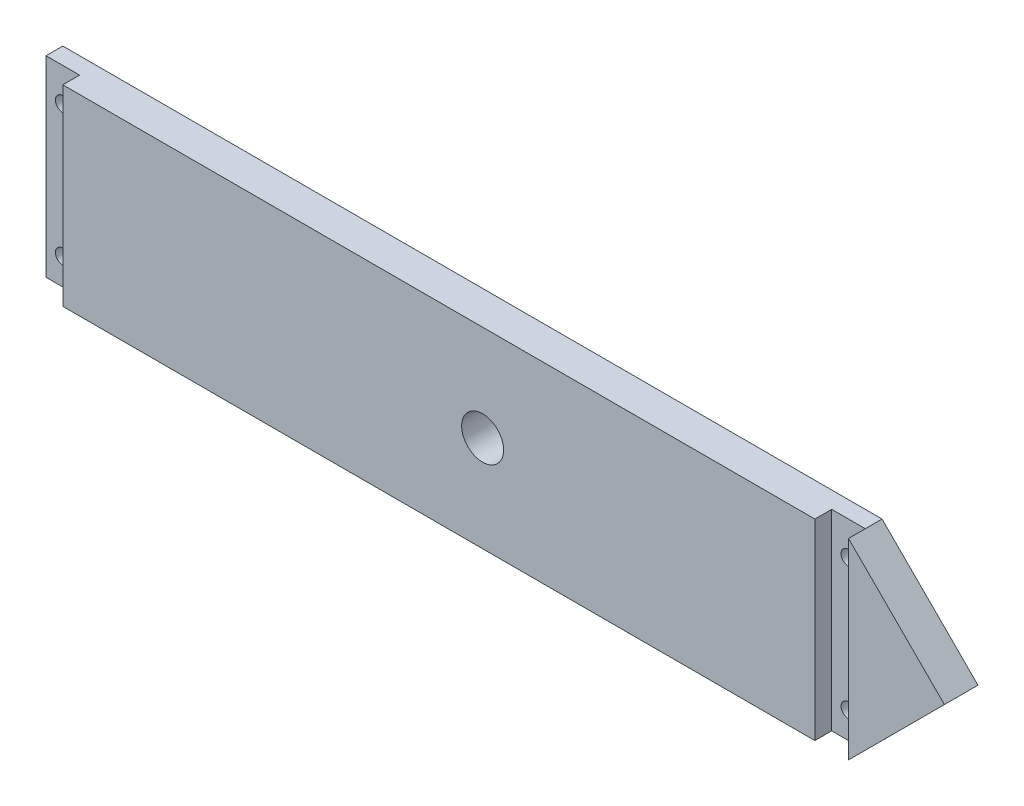
ISO-10303-21;
HEADER;
FILE_DESCRIPTION(('STEP AP214'),'2;1');
FILE_NAME('part.step','',(''),(''),'','','');
FILE_SCHEMA(('AUTOMOTIVE_DESIGN { 1 0 10303 214 1 1 1 1 }'));
ENDSEC;
DATA;
#1=APPLICATION_CONTEXT('core data for automotive mechanical design processes');
#2=APPLICATION_PROTOCOL_DEFINITION('international standard','automotive_design',2000,#1);
#3=PRODUCT_CONTEXT('',#1,'mechanical');
#4=PRODUCT('Part','Part','',(#3));
#5=PRODUCT_RELATED_PRODUCT_CATEGORY('part','',(#4));
#6=PRODUCT_DEFINITION_FORMATION('','',#4);
#7=PRODUCT_DEFINITION_CONTEXT('part definition',#1,'design');
#8=PRODUCT_DEFINITION('design','',#6,#7);
#9=PRODUCT_DEFINITION_SHAPE('','',#8);
#10=(LENGTH_UNIT() NAMED_UNIT(*) SI_UNIT(.MILLI.,.METRE.));
#11=(NAMED_UNIT(*) PLANE_ANGLE_UNIT() SI_UNIT($,.RADIAN.));
#12=(NAMED_UNIT(*) SI_UNIT($,.STERADIAN.) SOLID_ANGLE_UNIT());
#13=UNCERTAINTY_MEASURE_WITH_UNIT(LENGTH_MEASURE(1.E-05),#10,'distance_accuracy_value','');
#14=(GEOMETRIC_REPRESENTATION_CONTEXT(3) GLOBAL_UNCERTAINTY_ASSIGNED_CONTEXT((#13)) GLOBAL_UNIT_ASSIGNED_CONTEXT((#10,
#11,#12)) REPRESENTATION_CONTEXT('',''));
#15=CARTESIAN_POINT('',(0.,0.,0.));
#16=DIRECTION('',(0.,0.,1.));
#17=DIRECTION('',(1.,0.,0.));
#18=AXIS2_PLACEMENT_3D('',#15,#16,#17);
#19=CARTESIAN_POINT('',(86.51875,-18.13941,6.35));
#20=DIRECTION('',(0.,0.,-1.));
#21=DIRECTION('',(-1.,0.,0.));
#22=AXIS2_PLACEMENT_3D('',#19,#20,#21);
#23=PLANE('',#22);
#24=CARTESIAN_POINT('',(-0.793749999999996,0.,6.35));
#25=DIRECTION('',(0.,0.,1.));
#26=DIRECTION('',(1.,0.,0.));
#27=AXIS2_PLACEMENT_3D('',#24,#25,#26);
#28=CIRCLE('',#27,3.96875);
#29=CARTESIAN_POINT('',(3.175,0.,6.35));
#30=VERTEX_POINT('',#29);
#31=EDGE_CURVE('E148',#30,#30,#28,.T.);
#32=ORIENTED_EDGE('',*,*,#31,.F.);
#33=EDGE_LOOP('',(#32));
#34=FACE_BOUND('',#33,.T.);
#35=DIRECTION('',(1.,0.,0.));
#36=VECTOR('',#35,1.);
#37=CARTESIAN_POINT('',(86.51875,-18.13941,6.35));
#38=LINE('',#37,#36);
#39=CARTESIAN_POINT('',(-80.1687499999997,-18.13941,6.35));
#40=VERTEX_POINT('',#39);
#41=CARTESIAN_POINT('',(62.0306100000001,-18.13941,6.35));
#42=VERTEX_POINT('',#41);
#43=EDGE_CURVE('E138',#40,#42,#38,.T.);
#44=ORIENTED_EDGE('',*,*,#43,.T.);
#45=DIRECTION('',(0.,-1.,0.));
#46=VECTOR('',#45,1.);
#47=CARTESIAN_POINT('',(62.0306100000001,-18.13941,6.35));
#48=LINE('',#47,#46);
#49=CARTESIAN_POINT('',(62.0306100000001,18.13941,6.35));
#50=VERTEX_POINT('',#49);
#51=EDGE_CURVE('E188',#50,#42,#48,.T.);
#52=ORIENTED_EDGE('',*,*,#51,.F.);
#53=DIRECTION('',(-1.,0.,0.));
#54=VECTOR('',#53,1.);
#55=CARTESIAN_POINT('',(86.51875,18.13941,6.35));
#56=LINE('',#55,#54);
#57=CARTESIAN_POINT('',(-80.1687499999999,18.13941,6.35));
#58=VERTEX_POINT('',#57);
#59=EDGE_CURVE('E135',#50,#58,#56,.T.);
#60=ORIENTED_EDGE('',*,*,#59,.T.);
#61=DIRECTION('',(0.,1.,0.));
#62=VECTOR('',#61,1.);
#63=CARTESIAN_POINT('',(-80.1687499999999,18.13941,6.35));
#64=LINE('',#63,#62);
#65=EDGE_CURVE('E209',#40,#58,#64,.T.);
#66=ORIENTED_EDGE('',*,*,#65,.F.);
#67=EDGE_LOOP('',(#44,#52,#60,#66));
#68=FACE_BOUND('',#67,.T.);
#69=ADVANCED_FACE('F31',(#34,#68),#23,.F.);
#70=CARTESIAN_POINT('',(86.51875,18.13941,6.35));
#71=DIRECTION('',(0.,-1.,0.));
#72=DIRECTION('',(1.,0.,0.));
#73=AXIS2_PLACEMENT_3D('',#70,#71,#72);
#74=PLANE('',#73);
#75=DIRECTION('',(-1.,0.,0.));
#76=VECTOR('',#75,1.);
#77=CARTESIAN_POINT('',(62.0306100000001,18.13941,3.175));
#78=LINE('',#77,#76);
#79=CARTESIAN_POINT('',(68.3806100000099,18.1394100000318,3.175));
#80=VERTEX_POINT('',#79);
#81=CARTESIAN_POINT('',(62.0306100000001,18.13941,3.175));
#82=VERTEX_POINT('',#81);
#83=EDGE_CURVE('E200',#80,#82,#78,.T.);
#84=ORIENTED_EDGE('',*,*,#83,.F.);
#85=DIRECTION('',(0.,0.,1.));
#86=VECTOR('',#85,1.);
#87=CARTESIAN_POINT('',(68.3806100000099,18.1394100000318,0.));
#88=LINE('',#87,#86);
#89=CARTESIAN_POINT('',(68.3806100000099,18.1394100000318,0.));
#90=VERTEX_POINT('',#89);
#91=EDGE_CURVE('E120',#90,#80,#88,.T.);
#92=ORIENTED_EDGE('',*,*,#91,.F.);
#93=DIRECTION('',(-1.,0.,0.));
#94=VECTOR('',#93,1.);
#95=CARTESIAN_POINT('',(86.51875,18.13941,0.));
#96=LINE('',#95,#94);
#97=CARTESIAN_POINT('',(-86.51875,18.13941,0.));
#98=VERTEX_POINT('',#97);
#99=EDGE_CURVE('E140',#90,#98,#96,.T.);
#100=ORIENTED_EDGE('',*,*,#99,.T.);
#101=DIRECTION('',(0.,0.,-1.));
#102=VECTOR('',#101,1.);
#103=CARTESIAN_POINT('',(-86.51875,18.13941,6.35));
#104=LINE('',#103,#102);
#105=CARTESIAN_POINT('',(-86.51875,18.13941,3.175));
#106=VERTEX_POINT('',#105);
#107=EDGE_CURVE('E11',#106,#98,#104,.T.);
#108=ORIENTED_EDGE('',*,*,#107,.F.);
#109=DIRECTION('',(-1.,0.,0.));
#110=VECTOR('',#109,1.);
#111=CARTESIAN_POINT('',(-86.51875,18.13941,3.175));
#112=LINE('',#111,#110);
#113=CARTESIAN_POINT('',(-80.1687499999999,18.13941,3.175));
#114=VERTEX_POINT('',#113);
#115=EDGE_CURVE('E223',#114,#106,#112,.T.);
#116=ORIENTED_EDGE('',*,*,#115,.F.);
#117=DIRECTION('',(0.,0.,1.));
#118=VECTOR('',#117,1.);
#119=CARTESIAN_POINT('',(-80.1687499999999,18.13941,3.175));
#120=LINE('',#119,#118);
#121=EDGE_CURVE('E226',#114,#58,#120,.T.);
#122=ORIENTED_EDGE('',*,*,#121,.T.);
#123=ORIENTED_EDGE('',*,*,#59,.F.);
#124=DIRECTION('',(0.,0.,1.));
#125=VECTOR('',#124,1.);
#126=CARTESIAN_POINT('',(62.0306100000001,18.13941,3.175));
#127=LINE('',#126,#125);
#128=EDGE_CURVE('E207',#82,#50,#127,.T.);
#129=ORIENTED_EDGE('',*,*,#128,.F.);
#130=EDGE_LOOP('',(#84,#92,#100,#108,#116,#122,#123,#129));
#131=FACE_BOUND('',#130,.T.);
#132=ADVANCED_FACE('F33',(#131),#74,.F.);
#133=CARTESIAN_POINT('',(-86.51875,18.13941,6.35));
#134=DIRECTION('',(1.,0.,0.));
#135=DIRECTION('',(0.,0.,-1.));
#136=AXIS2_PLACEMENT_3D('',#133,#134,#135);
#137=PLANE('',#136);
#138=DIRECTION('',(0.,0.,-1.));
#139=VECTOR('',#138,1.);
#140=CARTESIAN_POINT('',(-86.51875,-18.13941,6.35));
#141=LINE('',#140,#139);
#142=CARTESIAN_POINT('',(-86.51875,-18.13941,3.175));
#143=VERTEX_POINT('',#142);
#144=CARTESIAN_POINT('',(-86.51875,-18.13941,0.));
#145=VERTEX_POINT('',#144);
#146=EDGE_CURVE('E40',#143,#145,#141,.T.);
#147=ORIENTED_EDGE('',*,*,#146,.F.);
#148=DIRECTION('',(0.,-1.,0.));
#149=VECTOR('',#148,1.);
#150=CARTESIAN_POINT('',(-86.51875,-18.13941,3.175));
#151=LINE('',#150,#149);
#152=EDGE_CURVE('E215',#106,#143,#151,.T.);
#153=ORIENTED_EDGE('',*,*,#152,.F.);
#154=ORIENTED_EDGE('',*,*,#107,.T.);
#155=DIRECTION('',(0.,-1.,0.));
#156=VECTOR('',#155,1.);
#157=CARTESIAN_POINT('',(-86.51875,18.13941,0.));
#158=LINE('',#157,#156);
#159=EDGE_CURVE('E136',#98,#145,#158,.T.);
#160=ORIENTED_EDGE('',*,*,#159,.T.);
#161=EDGE_LOOP('',(#147,#153,#154,#160));
#162=FACE_BOUND('',#161,.T.);
#163=ADVANCED_FACE('F238',(#162),#137,.F.);
#164=CARTESIAN_POINT('',(86.51875,-18.13941,6.35));
#165=DIRECTION('',(0.,1.,0.));
#166=DIRECTION('',(-1.,0.,0.));
#167=AXIS2_PLACEMENT_3D('',#164,#165,#166);
#168=PLANE('',#167);
#169=DIRECTION('',(1.,0.,0.));
#170=VECTOR('',#169,1.);
#171=CARTESIAN_POINT('',(86.51875,-18.13941,0.));
#172=LINE('',#171,#170);
#173=CARTESIAN_POINT('',(68.38061,-18.13941,0.));
#174=VERTEX_POINT('',#173);
#175=EDGE_CURVE('E127',#145,#174,#172,.T.);
#176=ORIENTED_EDGE('',*,*,#175,.T.);
#177=DIRECTION('',(0.,0.,1.));
#178=VECTOR('',#177,1.);
#179=CARTESIAN_POINT('',(68.38061,-18.13941,0.));
#180=LINE('',#179,#178);
#181=CARTESIAN_POINT('',(68.38061,-18.13941,3.175));
#182=VERTEX_POINT('',#181);
#183=EDGE_CURVE('E110',#174,#182,#180,.T.);
#184=ORIENTED_EDGE('',*,*,#183,.T.);
#185=DIRECTION('',(1.,0.,0.));
#186=VECTOR('',#185,1.);
#187=CARTESIAN_POINT('',(68.38061,-18.13941,3.175));
#188=LINE('',#187,#186);
#189=CARTESIAN_POINT('',(62.0306100000001,-18.13941,3.175));
#190=VERTEX_POINT('',#189);
#191=EDGE_CURVE('E193',#190,#182,#188,.T.);
#192=ORIENTED_EDGE('',*,*,#191,.F.);
#193=DIRECTION('',(0.,0.,1.));
#194=VECTOR('',#193,1.);
#195=CARTESIAN_POINT('',(62.0306100000001,-18.13941,3.175));
#196=LINE('',#195,#194);
#197=EDGE_CURVE('E203',#190,#42,#196,.T.);
#198=ORIENTED_EDGE('',*,*,#197,.T.);
#199=ORIENTED_EDGE('',*,*,#43,.F.);
#200=DIRECTION('',(0.,0.,1.));
#201=VECTOR('',#200,1.);
#202=CARTESIAN_POINT('',(-80.1687499999997,-18.13941,3.175));
#203=LINE('',#202,#201);
#204=CARTESIAN_POINT('',(-80.1687499999997,-18.13941,3.175));
#205=VERTEX_POINT('',#204);
#206=EDGE_CURVE('E56',#205,#40,#203,.T.);
#207=ORIENTED_EDGE('',*,*,#206,.F.);
#208=DIRECTION('',(1.,0.,0.));
#209=VECTOR('',#208,1.);
#210=CARTESIAN_POINT('',(-80.1687499999997,-18.13941,3.175));
#211=LINE('',#210,#209);
#212=EDGE_CURVE('E217',#143,#205,#211,.T.);
#213=ORIENTED_EDGE('',*,*,#212,.F.);
#214=ORIENTED_EDGE('',*,*,#146,.T.);
#215=EDGE_LOOP('',(#176,#184,#192,#198,#199,#207,#213,#214));
#216=FACE_BOUND('',#215,.T.);
#217=ADVANCED_FACE('F131',(#216),#168,.F.);
#218=DIRECTION('',(0.,1.,0.));
#219=VECTOR('',#218,1.);
#220=CARTESIAN_POINT('',(68.3806100000001,18.13941,6.35));
#221=LINE('',#220,#219);
#222=CARTESIAN_POINT('',(68.38061,-18.13941,6.35));
#223=VERTEX_POINT('',#222);
#224=CARTESIAN_POINT('',(68.3806100000099,18.1394100000318,6.35));
#225=VERTEX_POINT('',#224);
#226=EDGE_CURVE('E194',#223,#225,#221,.T.);
#227=ORIENTED_EDGE('',*,*,#226,.F.);
#228=DIRECTION('',(-0.707082026446583,-0.707131535059916,0.));
#229=VECTOR('',#228,1.);
#230=CARTESIAN_POINT('',(86.5187500000194,0.,6.35));
#231=LINE('',#230,#229);
#232=CARTESIAN_POINT('',(86.5187500000194,0.,6.35));
#233=VERTEX_POINT('',#232);
#234=EDGE_CURVE('E48',#233,#223,#231,.T.);
#235=ORIENTED_EDGE('',*,*,#234,.F.);
#236=DIRECTION('',(0.70708202644577,-0.707131535060729,0.));
#237=VECTOR('',#236,1.);
#238=CARTESIAN_POINT('',(86.5187500000194,0.,6.35));
#239=LINE('',#238,#237);
#240=EDGE_CURVE('E129',#225,#233,#239,.T.);
#241=ORIENTED_EDGE('',*,*,#240,.F.);
#242=EDGE_LOOP('',(#227,#235,#241));
#243=FACE_BOUND('',#242,.T.);
#244=ADVANCED_FACE('F259',(#243),#23,.F.);
#245=CARTESIAN_POINT('',(86.51875,-18.13941,0.));
#246=DIRECTION('',(0.,0.,-1.));
#247=DIRECTION('',(-1.,0.,0.));
#248=AXIS2_PLACEMENT_3D('',#245,#246,#247);
#249=PLANE('',#248);
#250=CARTESIAN_POINT('',(-83.34375,11.7894100000325,0.));
#251=DIRECTION('',(0.,0.,-1.));
#252=DIRECTION('',(-1.,0.,0.));
#253=AXIS2_PLACEMENT_3D('',#250,#251,#252);
#254=CIRCLE('',#253,2.75844);
#255=CARTESIAN_POINT('',(-86.10219,11.7894100000325,0.));
#256=VERTEX_POINT('',#255);
#257=EDGE_CURVE('E427',#256,#256,#254,.T.);
#258=ORIENTED_EDGE('',*,*,#257,.F.);
#259=EDGE_LOOP('',(#258));
#260=FACE_BOUND('',#259,.T.);
#261=CARTESIAN_POINT('',(-83.34375,-13.1787899999682,0.));
#262=DIRECTION('',(0.,0.,-1.));
#263=DIRECTION('',(-1.,0.,0.));
#264=AXIS2_PLACEMENT_3D('',#261,#262,#263);
#265=CIRCLE('',#264,2.75844);
#266=CARTESIAN_POINT('',(-86.10219,-13.1787899999682,0.));
#267=VERTEX_POINT('',#266);
#268=EDGE_CURVE('E163',#267,#267,#265,.T.);
#269=ORIENTED_EDGE('',*,*,#268,.F.);
#270=EDGE_LOOP('',(#269));
#271=FACE_BOUND('',#270,.T.);
#272=CARTESIAN_POINT('',(65.20561,11.7894100000312,0.));
#273=DIRECTION('',(0.,0.,-1.));
#274=DIRECTION('',(-1.,0.,0.));
#275=AXIS2_PLACEMENT_3D('',#272,#273,#274);
#276=CIRCLE('',#275,2.75844);
#277=CARTESIAN_POINT('',(62.44717,11.7894100000312,0.));
#278=VERTEX_POINT('',#277);
#279=EDGE_CURVE('E156',#278,#278,#276,.T.);
#280=ORIENTED_EDGE('',*,*,#279,.F.);
#281=EDGE_LOOP('',(#280));
#282=FACE_BOUND('',#281,.T.);
#283=CARTESIAN_POINT('',(65.20561,-13.1787899999682,0.));
#284=DIRECTION('',(0.,0.,-1.));
#285=DIRECTION('',(-1.,0.,0.));
#286=AXIS2_PLACEMENT_3D('',#283,#284,#285);
#287=CIRCLE('',#286,2.75844);
#288=CARTESIAN_POINT('',(62.44717,-13.1787899999682,0.));
#289=VERTEX_POINT('',#288);
#290=EDGE_CURVE('E152',#289,#289,#287,.T.);
#291=ORIENTED_EDGE('',*,*,#290,.F.);
#292=EDGE_LOOP('',(#291));
#293=FACE_BOUND('',#292,.T.);
#294=CARTESIAN_POINT('',(-0.793749999999996,0.,0.));
#295=DIRECTION('',(0.,0.,1.));
#296=DIRECTION('',(1.,0.,0.));
#297=AXIS2_PLACEMENT_3D('',#294,#295,#296);
#298=CIRCLE('',#297,3.96875);
#299=CARTESIAN_POINT('',(3.175,0.,0.));
#300=VERTEX_POINT('',#299);
#301=EDGE_CURVE('E177',#300,#300,#298,.T.);
#302=ORIENTED_EDGE('',*,*,#301,.T.);
#303=EDGE_LOOP('',(#302));
#304=FACE_BOUND('',#303,.T.);
#305=DIRECTION('',(-0.707082026446583,-0.707131535059916,0.));
#306=VECTOR('',#305,1.);
#307=CARTESIAN_POINT('',(86.5187500000194,0.,0.));
#308=LINE('',#307,#306);
#309=CARTESIAN_POINT('',(86.5187500000194,0.,0.));
#310=VERTEX_POINT('',#309);
#311=EDGE_CURVE('E113',#310,#174,#308,.T.);
#312=ORIENTED_EDGE('',*,*,#311,.T.);
#313=ORIENTED_EDGE('',*,*,#175,.F.);
#314=ORIENTED_EDGE('',*,*,#159,.F.);
#315=ORIENTED_EDGE('',*,*,#99,.F.);
#316=DIRECTION('',(0.70708202644577,-0.707131535060729,0.));
#317=VECTOR('',#316,1.);
#318=CARTESIAN_POINT('',(86.5187500000194,0.,0.));
#319=LINE('',#318,#317);
#320=EDGE_CURVE('E121',#90,#310,#319,.T.);
#321=ORIENTED_EDGE('',*,*,#320,.T.);
#322=EDGE_LOOP('',(#312,#313,#314,#315,#321));
#323=FACE_BOUND('',#322,.T.);
#324=ADVANCED_FACE('F125',(#260,#271,#282,#293,#304,#323),#249,.T.);
#325=CARTESIAN_POINT('',(-80.1687499999999,18.13941,3.175));
#326=DIRECTION('',(1.,0.,0.));
#327=DIRECTION('',(0.,1.,0.));
#328=AXIS2_PLACEMENT_3D('',#325,#326,#327);
#329=PLANE('',#328);
#330=ORIENTED_EDGE('',*,*,#65,.T.);
#331=ORIENTED_EDGE('',*,*,#121,.F.);
#332=DIRECTION('',(0.,1.,0.));
#333=VECTOR('',#332,1.);
#334=CARTESIAN_POINT('',(-80.1687499999999,18.13941,3.175));
#335=LINE('',#334,#333);
#336=EDGE_CURVE('E220',#205,#114,#335,.T.);
#337=ORIENTED_EDGE('',*,*,#336,.F.);
#338=ORIENTED_EDGE('',*,*,#206,.T.);
#339=EDGE_LOOP('',(#330,#331,#337,#338));
#340=FACE_BOUND('',#339,.T.);
#341=ADVANCED_FACE('F245',(#340),#329,.F.);
#342=CARTESIAN_POINT('',(-86.51875,18.13941,3.175));
#343=DIRECTION('',(0.,0.,-1.));
#344=DIRECTION('',(-1.,0.,0.));
#345=AXIS2_PLACEMENT_3D('',#342,#343,#344);
#346=PLANE('',#345);
#347=CARTESIAN_POINT('',(-83.34375,11.7894100000325,3.175));
#348=DIRECTION('',(0.,0.,-1.));
#349=DIRECTION('',(-1.,0.,0.));
#350=AXIS2_PLACEMENT_3D('',#347,#348,#349);
#351=CIRCLE('',#350,1.39699999999998);
#352=CARTESIAN_POINT('',(-84.74075,11.7894100000325,3.175));
#353=VERTEX_POINT('',#352);
#354=EDGE_CURVE('E35',#353,#353,#351,.T.);
#355=ORIENTED_EDGE('',*,*,#354,.T.);
#356=EDGE_LOOP('',(#355));
#357=FACE_BOUND('',#356,.T.);
#358=CARTESIAN_POINT('',(-83.34375,-13.1787899999682,3.175));
#359=DIRECTION('',(0.,0.,-1.));
#360=DIRECTION('',(-1.,0.,0.));
#361=AXIS2_PLACEMENT_3D('',#358,#359,#360);
#362=CIRCLE('',#361,1.39699999999998);
#363=CARTESIAN_POINT('',(-84.74075,-13.1787899999682,3.175));
#364=VERTEX_POINT('',#363);
#365=EDGE_CURVE('E154',#364,#364,#362,.T.);
#366=ORIENTED_EDGE('',*,*,#365,.T.);
#367=EDGE_LOOP('',(#366));
#368=FACE_BOUND('',#367,.T.);
#369=ORIENTED_EDGE('',*,*,#152,.T.);
#370=ORIENTED_EDGE('',*,*,#212,.T.);
#371=ORIENTED_EDGE('',*,*,#336,.T.);
#372=ORIENTED_EDGE('',*,*,#115,.T.);
#373=EDGE_LOOP('',(#369,#370,#371,#372));
#374=FACE_BOUND('',#373,.T.);
#375=ADVANCED_FACE('F240',(#357,#368,#374),#346,.F.);
#376=CARTESIAN_POINT('',(62.0306100000001,-18.13941,3.175));
#377=DIRECTION('',(-1.,0.,0.));
#378=DIRECTION('',(0.,-1.,0.));
#379=AXIS2_PLACEMENT_3D('',#376,#377,#378);
#380=PLANE('',#379);
#381=ORIENTED_EDGE('',*,*,#51,.T.);
#382=ORIENTED_EDGE('',*,*,#197,.F.);
#383=DIRECTION('',(0.,-1.,0.));
#384=VECTOR('',#383,1.);
#385=CARTESIAN_POINT('',(62.0306100000001,-18.13941,3.175));
#386=LINE('',#385,#384);
#387=EDGE_CURVE('E190',#82,#190,#386,.T.);
#388=ORIENTED_EDGE('',*,*,#387,.F.);
#389=ORIENTED_EDGE('',*,*,#128,.T.);
#390=EDGE_LOOP('',(#381,#382,#388,#389));
#391=FACE_BOUND('',#390,.T.);
#392=ADVANCED_FACE('F248',(#391),#380,.F.);
#393=CARTESIAN_POINT('',(68.3806100000001,18.13941,3.175));
#394=DIRECTION('',(1.,0.,0.));
#395=DIRECTION('',(0.,1.,0.));
#396=AXIS2_PLACEMENT_3D('',#393,#394,#395);
#397=PLANE('',#396);
#398=ORIENTED_EDGE('',*,*,#226,.T.);
#399=DIRECTION('',(0.,0.,1.));
#400=VECTOR('',#399,1.);
#401=CARTESIAN_POINT('',(68.3806100000001,18.13941,3.175));
#402=LINE('',#401,#400);
#403=EDGE_CURVE('E210',#80,#225,#402,.T.);
#404=ORIENTED_EDGE('',*,*,#403,.F.);
#405=DIRECTION('',(0.,1.,0.));
#406=VECTOR('',#405,1.);
#407=CARTESIAN_POINT('',(68.3806100000001,18.13941,3.175));
#408=LINE('',#407,#406);
#409=EDGE_CURVE('E197',#182,#80,#408,.T.);
#410=ORIENTED_EDGE('',*,*,#409,.F.);
#411=DIRECTION('',(0.,0.,1.));
#412=VECTOR('',#411,1.);
#413=CARTESIAN_POINT('',(68.38061,-18.13941,3.175));
#414=LINE('',#413,#412);
#415=EDGE_CURVE('E115',#182,#223,#414,.T.);
#416=ORIENTED_EDGE('',*,*,#415,.T.);
#417=EDGE_LOOP('',(#398,#404,#410,#416));
#418=FACE_BOUND('',#417,.T.);
#419=ADVANCED_FACE('F253',(#418),#397,.F.);
#420=CARTESIAN_POINT('',(62.0306100000001,18.13941,3.175));
#421=DIRECTION('',(0.,0.,-1.));
#422=DIRECTION('',(-1.,0.,0.));
#423=AXIS2_PLACEMENT_3D('',#420,#421,#422);
#424=PLANE('',#423);
#425=CARTESIAN_POINT('',(65.20561,11.7894100000312,3.175));
#426=DIRECTION('',(0.,0.,-1.));
#427=DIRECTION('',(-1.,0.,0.));
#428=AXIS2_PLACEMENT_3D('',#425,#426,#427);
#429=CIRCLE('',#428,1.39699999999998);
#430=CARTESIAN_POINT('',(63.80861,11.7894100000312,3.175));
#431=VERTEX_POINT('',#430);
#432=EDGE_CURVE('E150',#431,#431,#429,.T.);
#433=ORIENTED_EDGE('',*,*,#432,.T.);
#434=EDGE_LOOP('',(#433));
#435=FACE_BOUND('',#434,.T.);
#436=CARTESIAN_POINT('',(65.20561,-13.1787899999682,3.175));
#437=DIRECTION('',(0.,0.,-1.));
#438=DIRECTION('',(-1.,0.,0.));
#439=AXIS2_PLACEMENT_3D('',#436,#437,#438);
#440=CIRCLE('',#439,1.39699999999998);
#441=CARTESIAN_POINT('',(63.80861,-13.1787899999682,3.175));
#442=VERTEX_POINT('',#441);
#443=EDGE_CURVE('E145',#442,#442,#440,.T.);
#444=ORIENTED_EDGE('',*,*,#443,.T.);
#445=EDGE_LOOP('',(#444));
#446=FACE_BOUND('',#445,.T.);
#447=ORIENTED_EDGE('',*,*,#387,.T.);
#448=ORIENTED_EDGE('',*,*,#191,.T.);
#449=ORIENTED_EDGE('',*,*,#409,.T.);
#450=ORIENTED_EDGE('',*,*,#83,.T.);
#451=EDGE_LOOP('',(#447,#448,#449,#450));
#452=FACE_BOUND('',#451,.T.);
#453=ADVANCED_FACE('F250',(#435,#446,#452),#424,.F.);
#454=CARTESIAN_POINT('',(86.5187500000194,0.,0.));
#455=DIRECTION('',(-0.707131535059916,0.707082026446583,0.));
#456=DIRECTION('',(-0.707082026446583,-0.707131535059916,0.));
#457=AXIS2_PLACEMENT_3D('',#454,#455,#456);
#458=PLANE('',#457);
#459=ORIENTED_EDGE('',*,*,#234,.T.);
#460=ORIENTED_EDGE('',*,*,#415,.F.);
#461=ORIENTED_EDGE('',*,*,#183,.F.);
#462=ORIENTED_EDGE('',*,*,#311,.F.);
#463=DIRECTION('',(0.,0.,1.));
#464=VECTOR('',#463,1.);
#465=CARTESIAN_POINT('',(86.5187500000194,0.,0.));
#466=LINE('',#465,#464);
#467=EDGE_CURVE('E186',#310,#233,#466,.T.);
#468=ORIENTED_EDGE('',*,*,#467,.T.);
#469=EDGE_LOOP('',(#459,#460,#461,#462,#468));
#470=FACE_BOUND('',#469,.T.);
#471=ADVANCED_FACE('F112',(#470),#458,.F.);
#472=CARTESIAN_POINT('',(86.5187500000194,0.,0.));
#473=DIRECTION('',(-0.707131535060729,-0.70708202644577,0.));
#474=DIRECTION('',(0.70708202644577,-0.707131535060729,0.));
#475=AXIS2_PLACEMENT_3D('',#472,#473,#474);
#476=PLANE('',#475);
#477=ORIENTED_EDGE('',*,*,#240,.T.);
#478=ORIENTED_EDGE('',*,*,#467,.F.);
#479=ORIENTED_EDGE('',*,*,#320,.F.);
#480=ORIENTED_EDGE('',*,*,#91,.T.);
#481=ORIENTED_EDGE('',*,*,#403,.T.);
#482=EDGE_LOOP('',(#477,#478,#479,#480,#481));
#483=FACE_BOUND('',#482,.T.);
#484=ADVANCED_FACE('F257',(#483),#476,.F.);
#485=CARTESIAN_POINT('',(-0.793749999999996,0.,0.));
#486=DIRECTION('',(0.,0.,1.));
#487=DIRECTION('',(1.,0.,0.));
#488=AXIS2_PLACEMENT_3D('',#485,#486,#487);
#489=CYLINDRICAL_SURFACE('',#488,3.96875);
#490=ORIENTED_EDGE('',*,*,#301,.F.);
#491=EDGE_LOOP('',(#490));
#492=FACE_BOUND('',#491,.T.);
#493=ORIENTED_EDGE('',*,*,#31,.T.);
#494=EDGE_LOOP('',(#493));
#495=FACE_BOUND('',#494,.T.);
#496=ADVANCED_FACE('F277',(#492,#495),#489,.F.);
#497=CARTESIAN_POINT('',(65.20561,-13.1787899999682,0.));
#498=DIRECTION('',(0.,0.,-1.));
#499=DIRECTION('',(-1.,0.,0.));
#500=AXIS2_PLACEMENT_3D('',#497,#498,#499);
#501=CYLINDRICAL_SURFACE('',#500,1.39699999999998);
#502=CARTESIAN_POINT('',(65.20561,-13.1787899999682,1.56615756432699));
#503=DIRECTION('',(0.,0.,-1.));
#504=DIRECTION('',(-1.,0.,0.));
#505=AXIS2_PLACEMENT_3D('',#502,#503,#504);
#506=CIRCLE('',#505,1.39699999999998);
#507=CARTESIAN_POINT('',(63.80861,-13.1787899999682,1.56615756432699));
#508=VERTEX_POINT('',#507);
#509=EDGE_CURVE('E149',#508,#508,#506,.T.);
#510=ORIENTED_EDGE('',*,*,#509,.T.);
#511=EDGE_LOOP('',(#510));
#512=FACE_BOUND('',#511,.T.);
#513=ORIENTED_EDGE('',*,*,#443,.F.);
#514=EDGE_LOOP('',(#513));
#515=FACE_BOUND('',#514,.T.);
#516=ADVANCED_FACE('F279',(#512,#515),#501,.F.);
#517=CARTESIAN_POINT('',(65.20561,-13.1787899999682,0.));
#518=DIRECTION('',(0.,0.,-1.));
#519=DIRECTION('',(-1.,0.,0.));
#520=AXIS2_PLACEMENT_3D('',#517,#518,#519);
#521=CONICAL_SURFACE('',#520,2.75844,0.715584993317677);
#522=ORIENTED_EDGE('',*,*,#509,.F.);
#523=EDGE_LOOP('',(#522));
#524=FACE_BOUND('',#523,.T.);
#525=ORIENTED_EDGE('',*,*,#290,.T.);
#526=EDGE_LOOP('',(#525));
#527=FACE_BOUND('',#526,.T.);
#528=ADVANCED_FACE('F286',(#524,#527),#521,.F.);
#529=CARTESIAN_POINT('',(65.20561,11.7894100000312,0.));
#530=DIRECTION('',(0.,0.,-1.));
#531=DIRECTION('',(-1.,0.,0.));
#532=AXIS2_PLACEMENT_3D('',#529,#530,#531);
#533=CYLINDRICAL_SURFACE('',#532,1.39699999999998);
#534=CARTESIAN_POINT('',(65.20561,11.7894100000312,1.56615756432699));
#535=DIRECTION('',(0.,0.,-1.));
#536=DIRECTION('',(-1.,0.,0.));
#537=AXIS2_PLACEMENT_3D('',#534,#535,#536);
#538=CIRCLE('',#537,1.39699999999998);
#539=CARTESIAN_POINT('',(63.80861,11.7894100000312,1.56615756432699));
#540=VERTEX_POINT('',#539);
#541=EDGE_CURVE('E153',#540,#540,#538,.T.);
#542=ORIENTED_EDGE('',*,*,#541,.T.);
#543=EDGE_LOOP('',(#542));
#544=FACE_BOUND('',#543,.T.);
#545=ORIENTED_EDGE('',*,*,#432,.F.);
#546=EDGE_LOOP('',(#545));
#547=FACE_BOUND('',#546,.T.);
#548=ADVANCED_FACE('F360',(#544,#547),#533,.F.);
#549=CARTESIAN_POINT('',(65.20561,11.7894100000312,0.));
#550=DIRECTION('',(0.,0.,-1.));
#551=DIRECTION('',(-1.,0.,0.));
#552=AXIS2_PLACEMENT_3D('',#549,#550,#551);
#553=CONICAL_SURFACE('',#552,2.75844,0.715584993317677);
#554=ORIENTED_EDGE('',*,*,#541,.F.);
#555=EDGE_LOOP('',(#554));
#556=FACE_BOUND('',#555,.T.);
#557=ORIENTED_EDGE('',*,*,#279,.T.);
#558=EDGE_LOOP('',(#557));
#559=FACE_BOUND('',#558,.T.);
#560=ADVANCED_FACE('F368',(#556,#559),#553,.F.);
#561=CARTESIAN_POINT('',(-83.34375,-13.1787899999682,0.));
#562=DIRECTION('',(0.,0.,-1.));
#563=DIRECTION('',(-1.,0.,0.));
#564=AXIS2_PLACEMENT_3D('',#561,#562,#563);
#565=CYLINDRICAL_SURFACE('',#564,1.39699999999998);
#566=CARTESIAN_POINT('',(-83.34375,-13.1787899999682,1.56615756432699));
#567=DIRECTION('',(0.,0.,-1.));
#568=DIRECTION('',(-1.,0.,0.));
#569=AXIS2_PLACEMENT_3D('',#566,#567,#568);
#570=CIRCLE('',#569,1.39699999999998);
#571=CARTESIAN_POINT('',(-84.74075,-13.1787899999682,1.56615756432699));
#572=VERTEX_POINT('',#571);
#573=EDGE_CURVE('E157',#572,#572,#570,.T.);
#574=ORIENTED_EDGE('',*,*,#573,.T.);
#575=EDGE_LOOP('',(#574));
#576=FACE_BOUND('',#575,.T.);
#577=ORIENTED_EDGE('',*,*,#365,.F.);
#578=EDGE_LOOP('',(#577));
#579=FACE_BOUND('',#578,.T.);
#580=ADVANCED_FACE('F377',(#576,#579),#565,.F.);
#581=CARTESIAN_POINT('',(-83.34375,-13.1787899999682,0.));
#582=DIRECTION('',(0.,0.,-1.));
#583=DIRECTION('',(-1.,0.,0.));
#584=AXIS2_PLACEMENT_3D('',#581,#582,#583);
#585=CONICAL_SURFACE('',#584,2.75844,0.715584993317677);
#586=ORIENTED_EDGE('',*,*,#573,.F.);
#587=EDGE_LOOP('',(#586));
#588=FACE_BOUND('',#587,.T.);
#589=ORIENTED_EDGE('',*,*,#268,.T.);
#590=EDGE_LOOP('',(#589));
#591=FACE_BOUND('',#590,.T.);
#592=ADVANCED_FACE('F385',(#588,#591),#585,.F.);
#593=CARTESIAN_POINT('',(-83.34375,11.7894100000325,0.));
#594=DIRECTION('',(0.,0.,-1.));
#595=DIRECTION('',(-1.,0.,0.));
#596=AXIS2_PLACEMENT_3D('',#593,#594,#595);
#597=CYLINDRICAL_SURFACE('',#596,1.39699999999998);
#598=CARTESIAN_POINT('',(-83.34375,11.7894100000325,1.56615756432699));
#599=DIRECTION('',(0.,0.,-1.));
#600=DIRECTION('',(-1.,0.,0.));
#601=AXIS2_PLACEMENT_3D('',#598,#599,#600);
#602=CIRCLE('',#601,1.39699999999998);
#603=CARTESIAN_POINT('',(-84.74075,11.7894100000325,1.56615756432699));
#604=VERTEX_POINT('',#603);
#605=EDGE_CURVE('E424',#604,#604,#602,.T.);
#606=ORIENTED_EDGE('',*,*,#605,.T.);
#607=EDGE_LOOP('',(#606));
#608=FACE_BOUND('',#607,.T.);
#609=ORIENTED_EDGE('',*,*,#354,.F.);
#610=EDGE_LOOP('',(#609));
#611=FACE_BOUND('',#610,.T.);
#612=ADVANCED_FACE('F393',(#608,#611),#597,.F.);
#613=CARTESIAN_POINT('',(-83.34375,11.7894100000325,0.));
#614=DIRECTION('',(0.,0.,-1.));
#615=DIRECTION('',(-1.,0.,0.));
#616=AXIS2_PLACEMENT_3D('',#613,#614,#615);
#617=CONICAL_SURFACE('',#616,2.75844,0.715584993317677);
#618=ORIENTED_EDGE('',*,*,#605,.F.);
#619=EDGE_LOOP('',(#618));
#620=FACE_BOUND('',#619,.T.);
#621=ORIENTED_EDGE('',*,*,#257,.T.);
#622=EDGE_LOOP('',(#621));
#623=FACE_BOUND('',#622,.T.);
#624=ADVANCED_FACE('F402',(#620,#623),#617,.F.);
#625=CLOSED_SHELL('',(#69,#132,#163,#217,#244,#324,#341,#375,#392,#419,#453,#471,#484,#496,#516,
#528,#548,#560,#580,#592,#612,#624));
#626=MANIFOLD_SOLID_BREP('B2',#625);
#627=ADVANCED_BREP_SHAPE_REPRESENTATION('',(#18,#626),#14);
#628=SHAPE_DEFINITION_REPRESENTATION(#9,#627);
ENDSEC;
END-ISO-10303-21;
